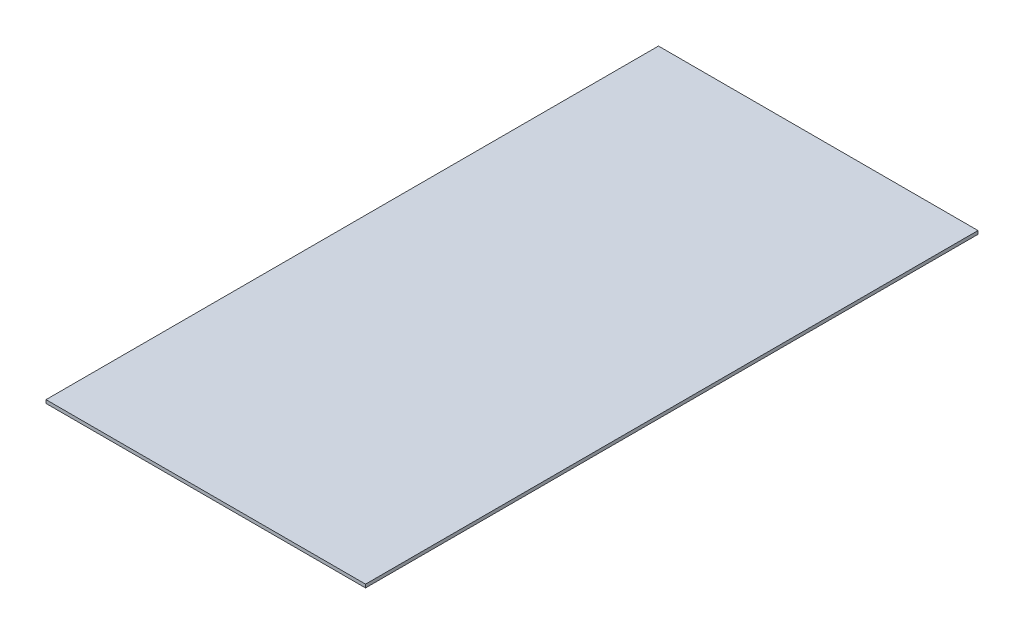
ISO-10303-21;
HEADER;
FILE_DESCRIPTION(('STEP AP214'),'2;1');
FILE_NAME('part.step','',(''),(''),'','','');
FILE_SCHEMA(('AUTOMOTIVE_DESIGN { 1 0 10303 214 1 1 1 1 }'));
ENDSEC;
DATA;
#1=APPLICATION_CONTEXT('core data for automotive mechanical design processes');
#2=APPLICATION_PROTOCOL_DEFINITION('international standard','automotive_design',2000,#1);
#3=PRODUCT_CONTEXT('',#1,'mechanical');
#4=PRODUCT('Part','Part','',(#3));
#5=PRODUCT_RELATED_PRODUCT_CATEGORY('part','',(#4));
#6=PRODUCT_DEFINITION_FORMATION('','',#4);
#7=PRODUCT_DEFINITION_CONTEXT('part definition',#1,'design');
#8=PRODUCT_DEFINITION('design','',#6,#7);
#9=PRODUCT_DEFINITION_SHAPE('','',#8);
#10=(LENGTH_UNIT() NAMED_UNIT(*) SI_UNIT(.MILLI.,.METRE.));
#11=(NAMED_UNIT(*) PLANE_ANGLE_UNIT() SI_UNIT($,.RADIAN.));
#12=(NAMED_UNIT(*) SI_UNIT($,.STERADIAN.) SOLID_ANGLE_UNIT());
#13=UNCERTAINTY_MEASURE_WITH_UNIT(LENGTH_MEASURE(1.E-05),#10,'distance_accuracy_value','');
#14=(GEOMETRIC_REPRESENTATION_CONTEXT(3) GLOBAL_UNCERTAINTY_ASSIGNED_CONTEXT((#13)) GLOBAL_UNIT_ASSIGNED_CONTEXT((#10,
#11,#12)) REPRESENTATION_CONTEXT('',''));
#15=CARTESIAN_POINT('',(0.,0.,0.));
#16=DIRECTION('',(0.,0.,1.));
#17=DIRECTION('',(1.,0.,0.));
#18=AXIS2_PLACEMENT_3D('',#15,#16,#17);
#19=CARTESIAN_POINT('',(152.4,1.5875,292.1));
#20=DIRECTION('',(-1.,0.,0.));
#21=DIRECTION('',(0.,0.,1.));
#22=AXIS2_PLACEMENT_3D('',#19,#20,#21);
#23=PLANE('',#22);
#24=DIRECTION('',(0.,0.,-1.));
#25=VECTOR('',#24,1.);
#26=CARTESIAN_POINT('',(152.4,-1.5875,292.1));
#27=LINE('',#26,#25);
#28=CARTESIAN_POINT('',(152.4,-1.5875,292.1));
#29=VERTEX_POINT('',#28);
#30=CARTESIAN_POINT('',(152.4,-1.5875,-292.1));
#31=VERTEX_POINT('',#30);
#32=EDGE_CURVE('E109',#29,#31,#27,.T.);
#33=ORIENTED_EDGE('',*,*,#32,.T.);
#34=DIRECTION('',(0.,-1.,0.));
#35=VECTOR('',#34,1.);
#36=CARTESIAN_POINT('',(152.4,1.5875,-292.1));
#37=LINE('',#36,#35);
#38=CARTESIAN_POINT('',(152.4,1.5875,-292.1));
#39=VERTEX_POINT('',#38);
#40=EDGE_CURVE('E11',#39,#31,#37,.T.);
#41=ORIENTED_EDGE('',*,*,#40,.F.);
#42=DIRECTION('',(0.,0.,-1.));
#43=VECTOR('',#42,1.);
#44=CARTESIAN_POINT('',(152.4,1.5875,292.1));
#45=LINE('',#44,#43);
#46=CARTESIAN_POINT('',(152.4,1.5875,292.1));
#47=VERTEX_POINT('',#46);
#48=EDGE_CURVE('E91',#47,#39,#45,.T.);
#49=ORIENTED_EDGE('',*,*,#48,.F.);
#50=DIRECTION('',(0.,-1.,0.));
#51=VECTOR('',#50,1.);
#52=CARTESIAN_POINT('',(152.4,1.5875,292.1));
#53=LINE('',#52,#51);
#54=EDGE_CURVE('E58',#47,#29,#53,.T.);
#55=ORIENTED_EDGE('',*,*,#54,.T.);
#56=EDGE_LOOP('',(#33,#41,#49,#55));
#57=FACE_BOUND('',#56,.T.);
#58=ADVANCED_FACE('F41',(#57),#23,.F.);
#59=CARTESIAN_POINT('',(152.4,1.5875,-292.1));
#60=DIRECTION('',(0.,0.,1.));
#61=DIRECTION('',(1.,0.,0.));
#62=AXIS2_PLACEMENT_3D('',#59,#60,#61);
#63=PLANE('',#62);
#64=DIRECTION('',(-1.,0.,0.));
#65=VECTOR('',#64,1.);
#66=CARTESIAN_POINT('',(152.4,-1.5875,-292.1));
#67=LINE('',#66,#65);
#68=CARTESIAN_POINT('',(-152.4,-1.5875,-292.1));
#69=VERTEX_POINT('',#68);
#70=EDGE_CURVE('E97',#31,#69,#67,.T.);
#71=ORIENTED_EDGE('',*,*,#70,.T.);
#72=DIRECTION('',(0.,-1.,0.));
#73=VECTOR('',#72,1.);
#74=CARTESIAN_POINT('',(-152.4,1.5875,-292.1));
#75=LINE('',#74,#73);
#76=CARTESIAN_POINT('',(-152.4,1.5875,-292.1));
#77=VERTEX_POINT('',#76);
#78=EDGE_CURVE('E50',#77,#69,#75,.T.);
#79=ORIENTED_EDGE('',*,*,#78,.F.);
#80=DIRECTION('',(-1.,0.,0.));
#81=VECTOR('',#80,1.);
#82=CARTESIAN_POINT('',(152.4,1.5875,-292.1));
#83=LINE('',#82,#81);
#84=EDGE_CURVE('E83',#39,#77,#83,.T.);
#85=ORIENTED_EDGE('',*,*,#84,.F.);
#86=ORIENTED_EDGE('',*,*,#40,.T.);
#87=EDGE_LOOP('',(#71,#79,#85,#86));
#88=FACE_BOUND('',#87,.T.);
#89=ADVANCED_FACE('F96',(#88),#63,.F.);
#90=CARTESIAN_POINT('',(-152.4,1.5875,292.1));
#91=DIRECTION('',(-1.,0.,0.));
#92=DIRECTION('',(0.,0.,1.));
#93=AXIS2_PLACEMENT_3D('',#90,#91,#92);
#94=PLANE('',#93);
#95=DIRECTION('',(0.,0.,-1.));
#96=VECTOR('',#95,1.);
#97=CARTESIAN_POINT('',(-152.4,-1.5875,292.1));
#98=LINE('',#97,#96);
#99=CARTESIAN_POINT('',(-152.4,-1.5875,292.1));
#100=VERTEX_POINT('',#99);
#101=EDGE_CURVE('E114',#100,#69,#98,.T.);
#102=ORIENTED_EDGE('',*,*,#101,.F.);
#103=DIRECTION('',(0.,-1.,0.));
#104=VECTOR('',#103,1.);
#105=CARTESIAN_POINT('',(-152.4,1.5875,292.1));
#106=LINE('',#105,#104);
#107=CARTESIAN_POINT('',(-152.4,1.5875,292.1));
#108=VERTEX_POINT('',#107);
#109=EDGE_CURVE('E72',#108,#100,#106,.T.);
#110=ORIENTED_EDGE('',*,*,#109,.F.);
#111=DIRECTION('',(0.,0.,-1.));
#112=VECTOR('',#111,1.);
#113=CARTESIAN_POINT('',(-152.4,1.5875,292.1));
#114=LINE('',#113,#112);
#115=EDGE_CURVE('E90',#108,#77,#114,.T.);
#116=ORIENTED_EDGE('',*,*,#115,.T.);
#117=ORIENTED_EDGE('',*,*,#78,.T.);
#118=EDGE_LOOP('',(#102,#110,#116,#117));
#119=FACE_BOUND('',#118,.T.);
#120=ADVANCED_FACE('F101',(#119),#94,.T.);
#121=CARTESIAN_POINT('',(152.4,1.5875,292.1));
#122=DIRECTION('',(0.,0.,1.));
#123=DIRECTION('',(1.,0.,0.));
#124=AXIS2_PLACEMENT_3D('',#121,#122,#123);
#125=PLANE('',#124);
#126=DIRECTION('',(-1.,0.,0.));
#127=VECTOR('',#126,1.);
#128=CARTESIAN_POINT('',(152.4,-1.5875,292.1));
#129=LINE('',#128,#127);
#130=EDGE_CURVE('E117',#29,#100,#129,.T.);
#131=ORIENTED_EDGE('',*,*,#130,.F.);
#132=ORIENTED_EDGE('',*,*,#54,.F.);
#133=DIRECTION('',(-1.,0.,0.));
#134=VECTOR('',#133,1.);
#135=CARTESIAN_POINT('',(152.4,1.5875,292.1));
#136=LINE('',#135,#134);
#137=EDGE_CURVE('E103',#47,#108,#136,.T.);
#138=ORIENTED_EDGE('',*,*,#137,.T.);
#139=ORIENTED_EDGE('',*,*,#109,.T.);
#140=EDGE_LOOP('',(#131,#132,#138,#139));
#141=FACE_BOUND('',#140,.T.);
#142=ADVANCED_FACE('F127',(#141),#125,.T.);
#143=CARTESIAN_POINT('',(0.,1.5875,0.));
#144=DIRECTION('',(0.,1.,0.));
#145=DIRECTION('',(0.,0.,1.));
#146=AXIS2_PLACEMENT_3D('',#143,#144,#145);
#147=PLANE('',#146);
#148=ORIENTED_EDGE('',*,*,#48,.T.);
#149=ORIENTED_EDGE('',*,*,#84,.T.);
#150=ORIENTED_EDGE('',*,*,#115,.F.);
#151=ORIENTED_EDGE('',*,*,#137,.F.);
#152=EDGE_LOOP('',(#148,#149,#150,#151));
#153=FACE_BOUND('',#152,.T.);
#154=ADVANCED_FACE('F87',(#153),#147,.T.);
#155=CARTESIAN_POINT('',(0.,-1.5875,0.));
#156=DIRECTION('',(0.,1.,0.));
#157=DIRECTION('',(0.,0.,1.));
#158=AXIS2_PLACEMENT_3D('',#155,#156,#157);
#159=PLANE('',#158);
#160=ORIENTED_EDGE('',*,*,#32,.F.);
#161=ORIENTED_EDGE('',*,*,#130,.T.);
#162=ORIENTED_EDGE('',*,*,#101,.T.);
#163=ORIENTED_EDGE('',*,*,#70,.F.);
#164=EDGE_LOOP('',(#160,#161,#162,#163));
#165=FACE_BOUND('',#164,.T.);
#166=ADVANCED_FACE('F126',(#165),#159,.F.);
#167=CLOSED_SHELL('',(#58,#89,#120,#142,#154,#166));
#168=MANIFOLD_SOLID_BREP('B2',#167);
#169=ADVANCED_BREP_SHAPE_REPRESENTATION('',(#18,#168),#14);
#170=SHAPE_DEFINITION_REPRESENTATION(#9,#169);
ENDSEC;
END-ISO-10303-21;
